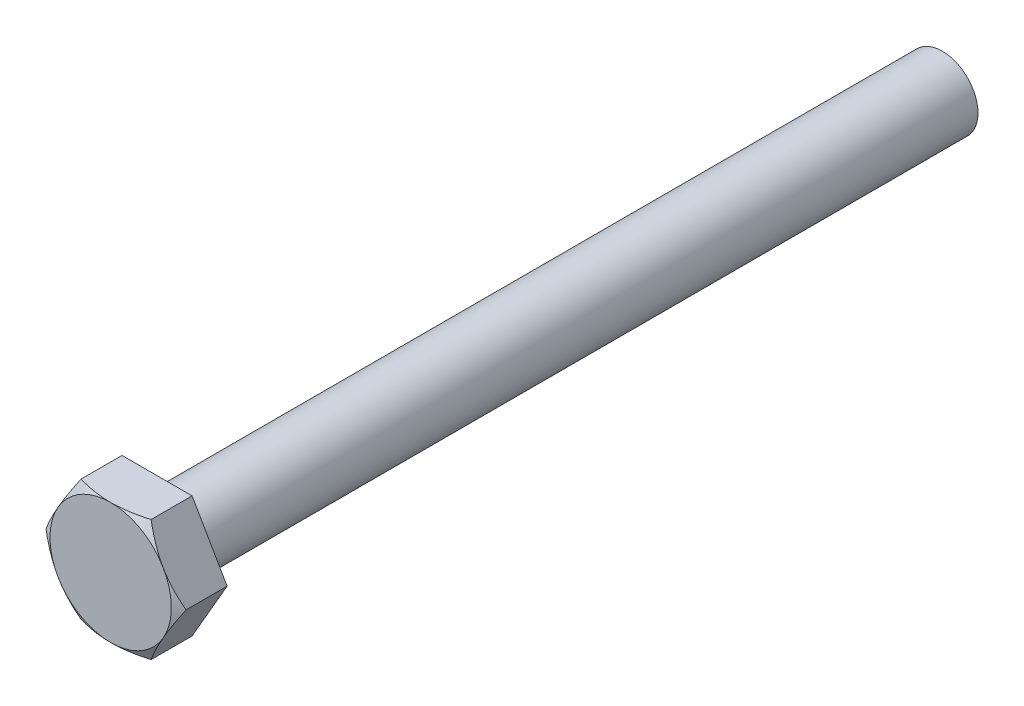
ISO-10303-21;
HEADER;
FILE_DESCRIPTION(('STEP AP214'),'2;1');
FILE_NAME('part.step','',(''),(''),'','','');
FILE_SCHEMA(('AUTOMOTIVE_DESIGN { 1 0 10303 214 1 1 1 1 }'));
ENDSEC;
DATA;
#1=APPLICATION_CONTEXT('core data for automotive mechanical design processes');
#2=APPLICATION_PROTOCOL_DEFINITION('international standard','automotive_design',2000,#1);
#3=PRODUCT_CONTEXT('',#1,'mechanical');
#4=PRODUCT('Part','Part','',(#3));
#5=PRODUCT_RELATED_PRODUCT_CATEGORY('part','',(#4));
#6=PRODUCT_DEFINITION_FORMATION('','',#4);
#7=PRODUCT_DEFINITION_CONTEXT('part definition',#1,'design');
#8=PRODUCT_DEFINITION('design','',#6,#7);
#9=PRODUCT_DEFINITION_SHAPE('','',#8);
#10=(LENGTH_UNIT() NAMED_UNIT(*) SI_UNIT(.MILLI.,.METRE.));
#11=(NAMED_UNIT(*) PLANE_ANGLE_UNIT() SI_UNIT($,.RADIAN.));
#12=(NAMED_UNIT(*) SI_UNIT($,.STERADIAN.) SOLID_ANGLE_UNIT());
#13=UNCERTAINTY_MEASURE_WITH_UNIT(LENGTH_MEASURE(1.E-05),#10,'distance_accuracy_value','');
#14=(GEOMETRIC_REPRESENTATION_CONTEXT(3) GLOBAL_UNCERTAINTY_ASSIGNED_CONTEXT((#13)) GLOBAL_UNIT_ASSIGNED_CONTEXT((#10,
#11,#12)) REPRESENTATION_CONTEXT('',''));
#15=CARTESIAN_POINT('',(0.,0.,0.));
#16=DIRECTION('',(0.,0.,1.));
#17=DIRECTION('',(1.,0.,0.));
#18=AXIS2_PLACEMENT_3D('',#15,#16,#17);
#19=CARTESIAN_POINT('',(-9.81495457622364,17.,123.));
#20=DIRECTION('',(0.866025403784438,-0.5,0.));
#21=DIRECTION('',(0.5,0.866025403784439,0.));
#22=AXIS2_PLACEMENT_3D('',#19,#20,#21);
#23=PLANE('',#22);
#24=CARTESIAN_POINT('',(-9.8148391061698,17.0002,121.481554575635));
#25=CARTESIAN_POINT('',(-10.0305678203106,16.6265469064567,121.606097159714));
#26=CARTESIAN_POINT('',(-10.2471379922619,16.251436365233,121.724988210087));
#27=CARTESIAN_POINT('',(-10.6820149725333,15.4982073403609,121.949896315283));
#28=CARTESIAN_POINT('',(-10.9003223270181,15.1200879107272,122.055909135882));
#29=CARTESIAN_POINT('',(-11.3390955943355,14.3601103187305,122.253635755638));
#30=CARTESIAN_POINT('',(-11.5595653468737,13.9782455058021,122.345315721686));
#31=CARTESIAN_POINT('',(-12.0020367960964,13.2118624748498,122.512407961256));
#32=CARTESIAN_POINT('',(-12.2240384042942,12.8273444100892,122.587821166432));
#33=CARTESIAN_POINT('',(-12.6638851266718,12.0655075393886,122.719172339868));
#34=CARTESIAN_POINT('',(-12.8816975866573,11.6882452921721,122.775545056779));
#35=CARTESIAN_POINT('',(-13.3183205574595,10.931992122991,122.870069499894));
#36=CARTESIAN_POINT('',(-13.5371310874053,10.5530011678939,122.908220875372));
#37=CARTESIAN_POINT('',(-13.9751197115118,9.79438261780433,122.965339335543));
#38=CARTESIAN_POINT('',(-14.1942970574164,9.41475631882946,122.984329216941));
#39=CARTESIAN_POINT('',(-14.6328540607501,8.65515330704033,123.002716299448));
#40=CARTESIAN_POINT('',(-14.8522337117183,8.27517660541658,123.002114105966));
#41=CARTESIAN_POINT('',(-15.2623694467912,7.56480067427072,122.982685296076));
#42=CARTESIAN_POINT('',(-15.4531547522161,7.23435083193735,122.96622784944));
#43=CARTESIAN_POINT('',(-15.8342702672496,6.57423939634648,122.918807466649));
#44=CARTESIAN_POINT('',(-16.0246004833366,6.2445777918682,122.887844738232));
#45=CARTESIAN_POINT('',(-16.4047337085118,5.58616773221974,122.811951054146));
#46=CARTESIAN_POINT('',(-16.5945360836128,5.25742037514752,122.76700746696));
#47=CARTESIAN_POINT('',(-16.9732372907546,4.60149064349036,122.663945146539));
#48=CARTESIAN_POINT('',(-17.1621361266206,4.27430826227985,122.605826469132));
#49=CARTESIAN_POINT('',(-17.7355629263239,3.281103910772,122.410229661277));
#50=CARTESIAN_POINT('',(-18.1184303000693,2.61795816688454,122.253247961959));
#51=CARTESIAN_POINT('',(-18.878456088099,1.30155488695447,121.89696389698));
#52=CARTESIAN_POINT('',(-19.2556242329599,0.648280497058983,121.697745203715));
#53=CARTESIAN_POINT('',(-19.6300246225011,-0.000199999999993854,121.481554575635));
#54=B_SPLINE_CURVE_WITH_KNOTS('',3,(#24,#25,#26,#27,#28,#29,#30,#31,#32,#33,#34,#35,#36,#37,#38,
#39,#40,#41,#42,#43,#44,#45,#46,#47,#48,#49,#50,#51,#52,#53),.UNSPECIFIED.,.F.,.F.,(4,2,2,2,2,2,
2,2,2,2,2,2,2,2,4),(0.,1.34725361023886,2.6949489909653,4.04577911356302,5.39653184888179,
6.71394507676439,8.03138366129191,9.3472530156348,10.6630817087628,11.808581597515,
12.9540650814946,14.1005865149997,15.2471030902392,17.590639246696,19.929575477219),.UNSPECIFIED.);
#55=CARTESIAN_POINT('',(-9.81495457622372,17.,121.48162124289));
#56=VERTEX_POINT('',#55);
#57=CARTESIAN_POINT('',(-14.7224318643355,8.5,123.));
#58=VERTEX_POINT('',#57);
#59=EDGE_CURVE('E124',#56,#58,#54,.T.);
#60=ORIENTED_EDGE('',*,*,#59,.F.);
#61=DIRECTION('',(0.,0.,-1.));
#62=VECTOR('',#61,1.);
#63=CARTESIAN_POINT('',(-9.81495457622364,17.,123.));
#64=LINE('',#63,#62);
#65=CARTESIAN_POINT('',(-9.81495457622364,17.,110.));
#66=VERTEX_POINT('',#65);
#67=EDGE_CURVE('E290',#56,#66,#64,.T.);
#68=ORIENTED_EDGE('',*,*,#67,.T.);
#69=DIRECTION('',(-0.5,-0.866025403784438,0.));
#70=VECTOR('',#69,1.);
#71=CARTESIAN_POINT('',(-9.81495457622364,17.,110.));
#72=LINE('',#71,#70);
#73=CARTESIAN_POINT('',(-19.6299091524473,0.,110.));
#74=VERTEX_POINT('',#73);
#75=EDGE_CURVE('E132',#66,#74,#72,.T.);
#76=ORIENTED_EDGE('',*,*,#75,.T.);
#77=DIRECTION('',(0.,0.,-1.));
#78=VECTOR('',#77,1.);
#79=CARTESIAN_POINT('',(-19.6299091524473,0.,123.));
#80=LINE('',#79,#78);
#81=CARTESIAN_POINT('',(-19.6299091524473,0.,121.48162124289));
#82=VERTEX_POINT('',#81);
#83=EDGE_CURVE('E147',#82,#74,#80,.T.);
#84=ORIENTED_EDGE('',*,*,#83,.F.);
#85=EDGE_CURVE('E133',#58,#82,#54,.T.);
#86=ORIENTED_EDGE('',*,*,#85,.F.);
#87=EDGE_LOOP('',(#60,#68,#76,#84,#86));
#88=FACE_BOUND('',#87,.T.);
#89=ADVANCED_FACE('F54',(#88),#23,.F.);
#90=CARTESIAN_POINT('',(-19.6299091524473,0.,123.));
#91=DIRECTION('',(0.866025403784439,0.5,0.));
#92=DIRECTION('',(-0.5,0.866025403784439,0.));
#93=AXIS2_PLACEMENT_3D('',#90,#91,#92);
#94=PLANE('',#93);
#95=CARTESIAN_POINT('',(-19.6300246225011,0.000200000000006953,121.481554575635));
#96=CARTESIAN_POINT('',(-19.4142959083604,-0.373453093543279,121.606097159714));
#97=CARTESIAN_POINT('',(-19.197725736409,-0.748563634767002,121.724988210087));
#98=CARTESIAN_POINT('',(-18.7628487561377,-1.50179265963908,121.949896315283));
#99=CARTESIAN_POINT('',(-18.5445414016528,-1.87991208927282,122.055909135882));
#100=CARTESIAN_POINT('',(-18.1057681343354,-2.6398896812695,122.253635755638));
#101=CARTESIAN_POINT('',(-17.8852983817972,-3.02175449419785,122.345315721686));
#102=CARTESIAN_POINT('',(-17.4428269325745,-3.78813752515018,122.512407961256));
#103=CARTESIAN_POINT('',(-17.2208253243767,-4.17265558991079,122.587821166432));
#104=CARTESIAN_POINT('',(-16.7809786019991,-4.93449246061139,122.719172339868));
#105=CARTESIAN_POINT('',(-16.5631661420136,-5.31175470782786,122.775545056779));
#106=CARTESIAN_POINT('',(-16.1265431712114,-6.06800787700895,122.870069499894));
#107=CARTESIAN_POINT('',(-15.9077326412656,-6.44699883210611,122.908220875372));
#108=CARTESIAN_POINT('',(-15.4697440171592,-7.20561738219567,122.965339335543));
#109=CARTESIAN_POINT('',(-15.2505666712546,-7.58524368117054,122.984329216941));
#110=CARTESIAN_POINT('',(-14.8120096679209,-8.34484669295966,123.002716299448));
#111=CARTESIAN_POINT('',(-14.5926300169526,-8.72482339458342,123.002114105966));
#112=CARTESIAN_POINT('',(-14.1824942818797,-9.43519932572928,122.982685296076));
#113=CARTESIAN_POINT('',(-13.9917089764549,-9.76564916806265,122.96622784944));
#114=CARTESIAN_POINT('',(-13.6105934614213,-10.4257606036535,122.918807466649));
#115=CARTESIAN_POINT('',(-13.4202632453343,-10.7554222081318,122.887844738232));
#116=CARTESIAN_POINT('',(-13.0401300201591,-11.4138322677803,122.811951054146));
#117=CARTESIAN_POINT('',(-12.8503276450581,-11.7425796248525,122.76700746696));
#118=CARTESIAN_POINT('',(-12.4716264379163,-12.3985093565097,122.663945146539));
#119=CARTESIAN_POINT('',(-12.2827276020504,-12.7256917377202,122.605826469132));
#120=CARTESIAN_POINT('',(-11.709300802347,-13.718896089228,122.410229661277));
#121=CARTESIAN_POINT('',(-11.3264334286016,-14.3820418331155,122.253247961959));
#122=CARTESIAN_POINT('',(-10.5664076405719,-15.6984451130455,121.89696389698));
#123=CARTESIAN_POINT('',(-10.189239495711,-16.351719502941,121.697745203715));
#124=CARTESIAN_POINT('',(-9.81483910616981,-17.0002,121.481554575635));
#125=B_SPLINE_CURVE_WITH_KNOTS('',3,(#95,#96,#97,#98,#99,#100,#101,#102,#103,#104,#105,#106,
#107,#108,#109,#110,#111,#112,#113,#114,#115,#116,#117,#118,#119,#120,#121,#122,#123,#124),
.UNSPECIFIED.,.F.,.F.,(4,2,2,2,2,2,2,2,2,2,2,2,2,2,4),(0.,1.34725361023886,2.6949489909653,
4.04577911356303,5.39653184888179,6.71394507676439,8.03138366129191,9.3472530156348,
10.6630817087628,11.808581597515,12.9540650814946,14.1005865149997,15.2471030902392,
17.590639246696,19.929575477219),.UNSPECIFIED.);
#126=CARTESIAN_POINT('',(-14.7224318643355,-8.49999999999999,123.));
#127=VERTEX_POINT('',#126);
#128=EDGE_CURVE('E139',#82,#127,#125,.T.);
#129=ORIENTED_EDGE('',*,*,#128,.F.);
#130=ORIENTED_EDGE('',*,*,#83,.T.);
#131=DIRECTION('',(0.5,-0.866025403784439,0.));
#132=VECTOR('',#131,1.);
#133=CARTESIAN_POINT('',(-19.6299091524473,0.,110.));
#134=LINE('',#133,#132);
#135=CARTESIAN_POINT('',(-9.81495457622365,-17.,110.));
#136=VERTEX_POINT('',#135);
#137=EDGE_CURVE('E281',#74,#136,#134,.T.);
#138=ORIENTED_EDGE('',*,*,#137,.T.);
#139=DIRECTION('',(0.,0.,-1.));
#140=VECTOR('',#139,1.);
#141=CARTESIAN_POINT('',(-9.81495457622365,-17.,123.));
#142=LINE('',#141,#140);
#143=CARTESIAN_POINT('',(-9.81495457622364,-17.,121.48162124289));
#144=VERTEX_POINT('',#143);
#145=EDGE_CURVE('E220',#144,#136,#142,.T.);
#146=ORIENTED_EDGE('',*,*,#145,.F.);
#147=EDGE_CURVE('E148',#127,#144,#125,.T.);
#148=ORIENTED_EDGE('',*,*,#147,.F.);
#149=EDGE_LOOP('',(#129,#130,#138,#146,#148));
#150=FACE_BOUND('',#149,.T.);
#151=ADVANCED_FACE('F208',(#150),#94,.F.);
#152=CARTESIAN_POINT('',(-9.81495457622365,-17.,123.));
#153=DIRECTION('',(0.,1.,0.));
#154=DIRECTION('',(-1.,0.,0.));
#155=AXIS2_PLACEMENT_3D('',#152,#153,#154);
#156=PLANE('',#155);
#157=CARTESIAN_POINT('',(-33.3594390914374,-17.,111.198200452818));
#158=CARTESIAN_POINT('',(-32.9706384399209,-17.,111.398200341522));
#159=CARTESIAN_POINT('',(-32.5815463697824,-17.,111.597633532846));
#160=CARTESIAN_POINT('',(-31.8027233805918,-17.,111.995251496857));
#161=CARTESIAN_POINT('',(-31.4129924595114,-17.,112.193436265571));
#162=CARTESIAN_POINT('',(-30.2427485766612,-17.,112.785949845329));
#163=CARTESIAN_POINT('',(-29.4611969892124,-17.,113.178231493841));
#164=CARTESIAN_POINT('',(-27.8935184038367,-17.,113.956814896487));
#165=CARTESIAN_POINT('',(-27.1073860038298,-17.,114.343105786825));
#166=CARTESIAN_POINT('',(-25.5311529294212,-17.,115.107546965402));
#167=CARTESIAN_POINT('',(-24.7410521985541,-17.,115.485697137402));
#168=CARTESIAN_POINT('',(-23.1145376879579,-17.,116.2514552716));
#169=CARTESIAN_POINT('',(-22.2778673101212,-17.,116.638519868649));
#170=CARTESIAN_POINT('',(-20.5981167469354,-17.,117.398404783723));
#171=CARTESIAN_POINT('',(-19.7550368875432,-17.,117.771225820376));
#172=CARTESIAN_POINT('',(-18.061526541666,-17.,118.498321900441));
#173=CARTESIAN_POINT('',(-17.2111013562626,-17.,118.852609197419));
#174=CARTESIAN_POINT('',(-15.928168866174,-17.,119.366137912946));
#175=CARTESIAN_POINT('',(-15.4992497889601,-17.,119.534352215754));
#176=CARTESIAN_POINT('',(-14.6387752894349,-17.,119.863893146348));
#177=CARTESIAN_POINT('',(-14.2072199070388,-17.,120.025219878121));
#178=CARTESIAN_POINT('',(-13.2705534680974,-17.,120.365665215771));
#179=CARTESIAN_POINT('',(-12.764933658292,-17.,120.543389924138));
#180=CARTESIAN_POINT('',(-11.7494203696704,-17.,120.886288145336));
#181=CARTESIAN_POINT('',(-11.239526749489,-17.,121.051461241163));
#182=CARTESIAN_POINT('',(-10.2153963896819,-17.,121.367001548691));
#183=CARTESIAN_POINT('',(-9.7011616171184,-17.,121.517375112454));
#184=CARTESIAN_POINT('',(-8.66797714981288,-17.,121.80091330825));
#185=CARTESIAN_POINT('',(-8.1490277774271,-17.,121.934079107511));
#186=CARTESIAN_POINT('',(-7.11627869390759,-17.,122.178166776831));
#187=CARTESIAN_POINT('',(-6.60256797273478,-17.,122.28946260962));
#188=CARTESIAN_POINT('',(-5.57087885460679,-17.,122.490244244432));
#189=CARTESIAN_POINT('',(-5.05290056211455,-17.,122.579730578684));
#190=CARTESIAN_POINT('',(-4.01353673617296,-17.,122.734336765993));
#191=CARTESIAN_POINT('',(-3.49215293797092,-17.,122.799468172559));
#192=CARTESIAN_POINT('',(-2.44673843214667,-17.,122.903320175113));
#193=CARTESIAN_POINT('',(-1.92270774566775,-17.,122.942040981733));
#194=CARTESIAN_POINT('',(-0.866331051381183,-17.,122.992025199195));
#195=CARTESIAN_POINT('',(-0.333967188718458,-17.,123.002916359029));
#196=CARTESIAN_POINT('',(0.730562845189475,-17.,122.995748240286));
#197=CARTESIAN_POINT('',(1.26272901631554,-17.,122.97768894429));
#198=CARTESIAN_POINT('',(2.32548141066001,-17.,122.913297121544));
#199=CARTESIAN_POINT('',(2.8560671380901,-17.,122.866956504217));
#200=CARTESIAN_POINT('',(3.91421698536023,-17.,122.747652274884));
#201=CARTESIAN_POINT('',(4.44178103064212,-17.,122.674688008807));
#202=CARTESIAN_POINT('',(5.50347774255836,-17.,122.502771693266));
#203=CARTESIAN_POINT('',(6.03753008880447,-17.,122.403328016736));
#204=CARTESIAN_POINT('',(7.1009799089611,-17.,122.18202170468));
#205=CARTESIAN_POINT('',(7.63037694417917,-17.,122.060156979539));
#206=CARTESIAN_POINT('',(8.68434813605264,-17.,121.796907815006));
#207=CARTESIAN_POINT('',(9.20892152613574,-17.,121.655520328352));
#208=CARTESIAN_POINT('',(10.2532381184158,-17.,121.355991754241));
#209=CARTESIAN_POINT('',(10.772981293492,-17.,121.197850572779));
#210=CARTESIAN_POINT('',(11.7842418712065,-17.,120.874837972002));
#211=CARTESIAN_POINT('',(12.2759639920886,-17.,120.710604094316));
#212=CARTESIAN_POINT('',(13.2555552358258,-17.,120.370995719983));
#213=CARTESIAN_POINT('',(13.7434242011549,-17.,120.195620770486));
#214=CARTESIAN_POINT('',(14.7157163146482,-17.,119.835312629295));
#215=CARTESIAN_POINT('',(15.2001387778271,-17.,119.650377594769));
#216=CARTESIAN_POINT('',(16.1657754363849,-17.,119.27235041045));
#217=CARTESIAN_POINT('',(16.6469896725089,-17.,119.079258364482));
#218=CARTESIAN_POINT('',(17.6070543041451,-17.,118.685861007233));
#219=CARTESIAN_POINT('',(18.0859016332031,-17.,118.485548226496));
#220=CARTESIAN_POINT('',(19.0410219112312,-17.,118.078869062008));
#221=CARTESIAN_POINT('',(19.5172948200784,-17.,117.872502584229));
#222=CARTESIAN_POINT('',(20.9425589284718,-17.,117.245638547753));
#223=CARTESIAN_POINT('',(21.8881155100321,-17.,116.817326718112));
#224=CARTESIAN_POINT('',(23.7189693100116,-17.,115.969495454374));
#225=CARTESIAN_POINT('',(24.6046666073102,-17.,115.550834696491));
#226=CARTESIAN_POINT('',(26.3708127505341,-17.,114.702530929011));
#227=CARTESIAN_POINT('',(27.2512614275654,-17.,114.272887568335));
#228=CARTESIAN_POINT('',(29.0050255734999,-17.,113.406308704853));
#229=CARTESIAN_POINT('',(29.878354886783,-17.,112.969401167034));
#230=CARTESIAN_POINT('',(31.1856724276973,-17.,112.308842728705));
#231=CARTESIAN_POINT('',(31.6209813254044,-17.,112.087799435296));
#232=CARTESIAN_POINT('',(32.490794121875,-17.,111.644139396376));
#233=CARTESIAN_POINT('',(32.9252980243898,-17.,111.421522658221));
#234=CARTESIAN_POINT('',(33.3594390914374,-17.,111.198200452818));
#235=B_SPLINE_CURVE_WITH_KNOTS('',3,(#157,#158,#159,#160,#161,#162,#163,#164,#165,#166,#167,
#168,#169,#170,#171,#172,#173,#174,#175,#176,#177,#178,#179,#180,#181,#182,#183,#184,#185,#186,
#187,#188,#189,#190,#191,#192,#193,#194,#195,#196,#197,#198,#199,#200,#201,#202,#203,#204,#205,
#206,#207,#208,#209,#210,#211,#212,#213,#214,#215,#216,#217,#218,#219,#220,#221,#222,#223,#224,
#225,#226,#227,#228,#229,#230,#231,#232,#233,#234),.UNSPECIFIED.,.F.,.F.,(4,2,2,2,2,2,2,2,2,2,2,
2,2,2,2,2,2,2,2,2,2,2,2,2,2,2,2,2,2,2,2,2,2,2,2,2,2,2,4),(0.,1.31167483529986,2.62335384351833,
5.24675402190231,7.87445718666224,10.502197847419,13.267688167751,16.0330387763388,
18.7965373491278,20.1786645378782,21.5607708520237,23.1684653159108,24.7762131691943,
26.38326792872,27.9902136222274,29.5666833551458,31.1431146127258,32.7187970901174,
34.2944670008276,35.8911053967669,37.487744753412,39.0848410828587,40.6819766513632,
42.3111281278075,43.9404315163644,45.5699895073477,47.1995566424574,48.7546761403721,
50.3098588894954,51.8653425462884,53.4208064104485,54.9779282932983,56.5350743745854,
59.6489770134654,62.5878774038527,65.5268718593572,68.4563941123712,69.9210368195007,
71.3856726840938),.UNSPECIFIED.);
#236=CARTESIAN_POINT('',(0.,-17.,123.));
#237=VERTEX_POINT('',#236);
#238=EDGE_CURVE('E202',#144,#237,#235,.T.);
#239=ORIENTED_EDGE('',*,*,#238,.F.);
#240=ORIENTED_EDGE('',*,*,#145,.T.);
#241=DIRECTION('',(1.,0.,0.));
#242=VECTOR('',#241,1.);
#243=CARTESIAN_POINT('',(-9.81495457622365,-17.,110.));
#244=LINE('',#243,#242);
#245=CARTESIAN_POINT('',(9.81495457622364,-17.,110.));
#246=VERTEX_POINT('',#245);
#247=EDGE_CURVE('E237',#136,#246,#244,.T.);
#248=ORIENTED_EDGE('',*,*,#247,.T.);
#249=DIRECTION('',(0.,0.,-1.));
#250=VECTOR('',#249,1.);
#251=CARTESIAN_POINT('',(9.81495457622364,-17.,123.));
#252=LINE('',#251,#250);
#253=CARTESIAN_POINT('',(9.81495457622364,-17.,121.48162124289));
#254=VERTEX_POINT('',#253);
#255=EDGE_CURVE('E235',#254,#246,#252,.T.);
#256=ORIENTED_EDGE('',*,*,#255,.F.);
#257=EDGE_CURVE('E196',#237,#254,#235,.T.);
#258=ORIENTED_EDGE('',*,*,#257,.F.);
#259=EDGE_LOOP('',(#239,#240,#248,#256,#258));
#260=FACE_BOUND('',#259,.T.);
#261=ADVANCED_FACE('F204',(#260),#156,.F.);
#262=CARTESIAN_POINT('',(9.81495457622364,-17.,123.));
#263=DIRECTION('',(-0.866025403784438,0.5,0.));
#264=DIRECTION('',(-0.5,-0.866025403784439,0.));
#265=AXIS2_PLACEMENT_3D('',#262,#263,#264);
#266=PLANE('',#265);
#267=CARTESIAN_POINT('',(9.8148391061698,-17.0002,121.481554575635));
#268=CARTESIAN_POINT('',(10.0305678203106,-16.6265469064567,121.606097159714));
#269=CARTESIAN_POINT('',(10.2471379922619,-16.251436365233,121.724988210087));
#270=CARTESIAN_POINT('',(10.6820149725333,-15.4982073403609,121.949896315283));
#271=CARTESIAN_POINT('',(10.9003223270181,-15.1200879107272,122.055909135882));
#272=CARTESIAN_POINT('',(11.3390955943355,-14.3601103187305,122.253635755638));
#273=CARTESIAN_POINT('',(11.5595653468737,-13.9782455058021,122.345315721686));
#274=CARTESIAN_POINT('',(12.0020367960964,-13.2118624748498,122.512407961256));
#275=CARTESIAN_POINT('',(12.2240384042942,-12.8273444100892,122.587821166432));
#276=CARTESIAN_POINT('',(12.6638851266718,-12.0655075393886,122.719172339868));
#277=CARTESIAN_POINT('',(12.8816975866573,-11.6882452921721,122.77554505678));
#278=CARTESIAN_POINT('',(13.3183205574595,-10.931992122991,122.870069499894));
#279=CARTESIAN_POINT('',(13.5371310874053,-10.5530011678939,122.908220875372));
#280=CARTESIAN_POINT('',(13.9751197115118,-9.79438261780432,122.965339335543));
#281=CARTESIAN_POINT('',(14.1942970574164,-9.41475631882945,122.984329216941));
#282=CARTESIAN_POINT('',(14.6328540607501,-8.65515330704033,123.002716299448));
#283=CARTESIAN_POINT('',(14.8522337117183,-8.27517660541657,123.002114105966));
#284=CARTESIAN_POINT('',(15.2623694467912,-7.56480067427071,122.982685296076));
#285=CARTESIAN_POINT('',(15.4531547522161,-7.23435083193734,122.96622784944));
#286=CARTESIAN_POINT('',(15.8342702672496,-6.57423939634648,122.918807466649));
#287=CARTESIAN_POINT('',(16.0246004833366,-6.24457779186819,122.887844738232));
#288=CARTESIAN_POINT('',(16.4047337085118,-5.58616773221973,122.811951054146));
#289=CARTESIAN_POINT('',(16.5945360836128,-5.25742037514751,122.76700746696));
#290=CARTESIAN_POINT('',(16.9732372907546,-4.60149064349034,122.663945146539));
#291=CARTESIAN_POINT('',(17.1621361266206,-4.27430826227984,122.605826469132));
#292=CARTESIAN_POINT('',(17.7355629263239,-3.28110391077199,122.410229661277));
#293=CARTESIAN_POINT('',(18.1184303000693,-2.61795816688453,122.253247961959));
#294=CARTESIAN_POINT('',(18.878456088099,-1.30155488695445,121.89696389698));
#295=CARTESIAN_POINT('',(19.2556242329599,-0.648280497058969,121.697745203715));
#296=CARTESIAN_POINT('',(19.6300246225011,0.000200000000006671,121.481554575635));
#297=B_SPLINE_CURVE_WITH_KNOTS('',3,(#267,#268,#269,#270,#271,#272,#273,#274,#275,#276,#277,
#278,#279,#280,#281,#282,#283,#284,#285,#286,#287,#288,#289,#290,#291,#292,#293,#294,#295,#296),
.UNSPECIFIED.,.F.,.F.,(4,2,2,2,2,2,2,2,2,2,2,2,2,2,4),(0.,1.34725361023887,2.6949489909653,
4.04577911356303,5.3965318488818,6.7139450767644,8.03138366129191,9.3472530156348,
10.6630817087628,11.808581597515,12.9540650814946,14.1005865149997,15.2471030902392,
17.590639246696,19.929575477219),.UNSPECIFIED.);
#298=CARTESIAN_POINT('',(14.7224318643355,-8.5,123.));
#299=VERTEX_POINT('',#298);
#300=EDGE_CURVE('E203',#254,#299,#297,.T.);
#301=ORIENTED_EDGE('',*,*,#300,.F.);
#302=ORIENTED_EDGE('',*,*,#255,.T.);
#303=DIRECTION('',(0.5,0.866025403784439,0.));
#304=VECTOR('',#303,1.);
#305=CARTESIAN_POINT('',(9.81495457622364,-17.,110.));
#306=LINE('',#305,#304);
#307=CARTESIAN_POINT('',(19.6299091524473,0.,110.));
#308=VERTEX_POINT('',#307);
#309=EDGE_CURVE('E282',#246,#308,#306,.T.);
#310=ORIENTED_EDGE('',*,*,#309,.T.);
#311=DIRECTION('',(0.,0.,-1.));
#312=VECTOR('',#311,1.);
#313=CARTESIAN_POINT('',(19.6299091524473,0.,123.));
#314=LINE('',#313,#312);
#315=CARTESIAN_POINT('',(19.6299091524473,0.,121.48162124289));
#316=VERTEX_POINT('',#315);
#317=EDGE_CURVE('E241',#316,#308,#314,.T.);
#318=ORIENTED_EDGE('',*,*,#317,.F.);
#319=EDGE_CURVE('E190',#299,#316,#297,.T.);
#320=ORIENTED_EDGE('',*,*,#319,.F.);
#321=EDGE_LOOP('',(#301,#302,#310,#318,#320));
#322=FACE_BOUND('',#321,.T.);
#323=ADVANCED_FACE('F207',(#322),#266,.F.);
#324=CARTESIAN_POINT('',(19.6299091524473,0.,123.));
#325=DIRECTION('',(-0.866025403784439,-0.5,0.));
#326=DIRECTION('',(0.5,-0.866025403784439,0.));
#327=AXIS2_PLACEMENT_3D('',#324,#325,#326);
#328=PLANE('',#327);
#329=CARTESIAN_POINT('',(19.6300246225011,-0.000199999999993507,121.481554575635));
#330=CARTESIAN_POINT('',(19.4142959083604,0.373453093543293,121.606097159714));
#331=CARTESIAN_POINT('',(19.197725736409,0.748563634767016,121.724988210087));
#332=CARTESIAN_POINT('',(18.7628487561376,1.50179265963909,121.949896315283));
#333=CARTESIAN_POINT('',(18.5445414016528,1.87991208927283,122.055909135882));
#334=CARTESIAN_POINT('',(18.1057681343354,2.63988968126952,122.253635755638));
#335=CARTESIAN_POINT('',(17.8852983817972,3.02175449419786,122.345315721686));
#336=CARTESIAN_POINT('',(17.4428269325745,3.78813752515019,122.512407961256));
#337=CARTESIAN_POINT('',(17.2208253243767,4.17265558991081,122.587821166432));
#338=CARTESIAN_POINT('',(16.7809786019991,4.9344924606114,122.719172339868));
#339=CARTESIAN_POINT('',(16.5631661420136,5.31175470782788,122.775545056779));
#340=CARTESIAN_POINT('',(16.1265431712114,6.06800787700896,122.870069499894));
#341=CARTESIAN_POINT('',(15.9077326412656,6.44699883210613,122.908220875372));
#342=CARTESIAN_POINT('',(15.4697440171592,7.20561738219568,122.965339335543));
#343=CARTESIAN_POINT('',(15.2505666712546,7.58524368117055,122.984329216941));
#344=CARTESIAN_POINT('',(14.8120096679209,8.34484669295967,123.002716299448));
#345=CARTESIAN_POINT('',(14.5926300169526,8.72482339458343,123.002114105966));
#346=CARTESIAN_POINT('',(14.1824942818797,9.43519932572929,122.982685296076));
#347=CARTESIAN_POINT('',(13.9917089764549,9.76564916806266,122.96622784944));
#348=CARTESIAN_POINT('',(13.6105934614213,10.4257606036535,122.918807466649));
#349=CARTESIAN_POINT('',(13.4202632453343,10.7554222081318,122.887844738232));
#350=CARTESIAN_POINT('',(13.0401300201591,11.4138322677803,122.811951054146));
#351=CARTESIAN_POINT('',(12.8503276450581,11.7425796248525,122.76700746696));
#352=CARTESIAN_POINT('',(12.4716264379163,12.3985093565097,122.663945146539));
#353=CARTESIAN_POINT('',(12.2827276020504,12.7256917377202,122.605826469132));
#354=CARTESIAN_POINT('',(11.709300802347,13.718896089228,122.410229661277));
#355=CARTESIAN_POINT('',(11.3264334286016,14.3820418331155,122.253247961959));
#356=CARTESIAN_POINT('',(10.5664076405719,15.6984451130455,121.89696389698));
#357=CARTESIAN_POINT('',(10.189239495711,16.351719502941,121.697745203715));
#358=CARTESIAN_POINT('',(9.81483910616982,17.0002,121.481554575635));
#359=B_SPLINE_CURVE_WITH_KNOTS('',3,(#329,#330,#331,#332,#333,#334,#335,#336,#337,#338,#339,
#340,#341,#342,#343,#344,#345,#346,#347,#348,#349,#350,#351,#352,#353,#354,#355,#356,#357,#358),
.UNSPECIFIED.,.F.,.F.,(4,2,2,2,2,2,2,2,2,2,2,2,2,2,4),(0.,1.34725361023886,2.6949489909653,
4.04577911356303,5.3965318488818,6.71394507676439,8.03138366129191,9.3472530156348,
10.6630817087628,11.808581597515,12.9540650814946,14.1005865149997,15.2471030902392,
17.590639246696,19.929575477219),.UNSPECIFIED.);
#360=CARTESIAN_POINT('',(14.7224318643355,8.5,123.));
#361=VERTEX_POINT('',#360);
#362=EDGE_CURVE('E299',#316,#361,#359,.T.);
#363=ORIENTED_EDGE('',*,*,#362,.F.);
#364=ORIENTED_EDGE('',*,*,#317,.T.);
#365=DIRECTION('',(-0.5,0.866025403784439,0.));
#366=VECTOR('',#365,1.);
#367=CARTESIAN_POINT('',(19.6299091524473,0.,110.));
#368=LINE('',#367,#366);
#369=CARTESIAN_POINT('',(9.81495457622365,17.,110.));
#370=VERTEX_POINT('',#369);
#371=EDGE_CURVE('E286',#308,#370,#368,.T.);
#372=ORIENTED_EDGE('',*,*,#371,.T.);
#373=DIRECTION('',(0.,0.,-1.));
#374=VECTOR('',#373,1.);
#375=CARTESIAN_POINT('',(9.81495457622365,17.,123.));
#376=LINE('',#375,#374);
#377=CARTESIAN_POINT('',(9.81495457622365,17.,121.48162124289));
#378=VERTEX_POINT('',#377);
#379=EDGE_CURVE('E244',#378,#370,#376,.T.);
#380=ORIENTED_EDGE('',*,*,#379,.F.);
#381=EDGE_CURVE('E182',#361,#378,#359,.T.);
#382=ORIENTED_EDGE('',*,*,#381,.F.);
#383=EDGE_LOOP('',(#363,#364,#372,#380,#382));
#384=FACE_BOUND('',#383,.T.);
#385=ADVANCED_FACE('F272',(#384),#328,.F.);
#386=CARTESIAN_POINT('',(9.81495457622365,17.,123.));
#387=DIRECTION('',(0.,-1.,0.));
#388=DIRECTION('',(0.,0.,-1.));
#389=AXIS2_PLACEMENT_3D('',#386,#387,#388);
#390=PLANE('',#389);
#391=CARTESIAN_POINT('',(33.3594390914374,17.,111.198200452818));
#392=CARTESIAN_POINT('',(32.9706384399209,17.,111.398200341522));
#393=CARTESIAN_POINT('',(32.5815463697824,17.,111.597633532846));
#394=CARTESIAN_POINT('',(31.8027233805918,17.,111.995251496857));
#395=CARTESIAN_POINT('',(31.4129924595114,17.,112.19343626557));
#396=CARTESIAN_POINT('',(30.2427485766612,17.,112.785949845329));
#397=CARTESIAN_POINT('',(29.4611969892124,17.,113.178231493841));
#398=CARTESIAN_POINT('',(27.8935184038367,17.,113.956814896487));
#399=CARTESIAN_POINT('',(27.1073860038298,17.,114.343105786825));
#400=CARTESIAN_POINT('',(25.5311529294212,17.,115.107546965402));
#401=CARTESIAN_POINT('',(24.7410521985541,17.,115.485697137402));
#402=CARTESIAN_POINT('',(23.1145376879579,17.,116.2514552716));
#403=CARTESIAN_POINT('',(22.2778673101212,17.,116.638519868649));
#404=CARTESIAN_POINT('',(20.5981167469354,17.,117.398404783723));
#405=CARTESIAN_POINT('',(19.7550368875432,17.,117.771225820376));
#406=CARTESIAN_POINT('',(18.061526541666,17.,118.498321900441));
#407=CARTESIAN_POINT('',(17.2111013562626,17.,118.852609197419));
#408=CARTESIAN_POINT('',(15.928168866174,17.,119.366137912946));
#409=CARTESIAN_POINT('',(15.4992497889601,17.,119.534352215754));
#410=CARTESIAN_POINT('',(14.6387752894349,17.,119.863893146348));
#411=CARTESIAN_POINT('',(14.2072199070388,17.,120.025219878121));
#412=CARTESIAN_POINT('',(13.2705534680974,17.,120.365665215771));
#413=CARTESIAN_POINT('',(12.764933658292,17.,120.543389924138));
#414=CARTESIAN_POINT('',(11.7494203696704,17.,120.886288145336));
#415=CARTESIAN_POINT('',(11.239526749489,17.,121.051461241163));
#416=CARTESIAN_POINT('',(10.2153963896819,17.,121.367001548691));
#417=CARTESIAN_POINT('',(9.7011616171184,17.,121.517375112454));
#418=CARTESIAN_POINT('',(8.66797714981288,17.,121.80091330825));
#419=CARTESIAN_POINT('',(8.14902777742711,17.,121.934079107511));
#420=CARTESIAN_POINT('',(7.11627869390759,17.,122.178166776831));
#421=CARTESIAN_POINT('',(6.60256797273479,17.,122.28946260962));
#422=CARTESIAN_POINT('',(5.5708788546068,17.,122.490244244432));
#423=CARTESIAN_POINT('',(5.05290056211456,17.,122.579730578684));
#424=CARTESIAN_POINT('',(4.01353673617297,17.,122.734336765993));
#425=CARTESIAN_POINT('',(3.49215293797093,17.,122.799468172559));
#426=CARTESIAN_POINT('',(2.44673843214668,17.,122.903320175113));
#427=CARTESIAN_POINT('',(1.92270774566776,17.,122.942040981733));
#428=CARTESIAN_POINT('',(0.866331051381189,17.,122.992025199195));
#429=CARTESIAN_POINT('',(0.333967188718463,17.,123.002916359029));
#430=CARTESIAN_POINT('',(-0.730562845189469,17.,122.995748240286));
#431=CARTESIAN_POINT('',(-1.26272901631553,17.,122.97768894429));
#432=CARTESIAN_POINT('',(-2.32548141066,17.,122.913297121544));
#433=CARTESIAN_POINT('',(-2.85606713809009,17.,122.866956504217));
#434=CARTESIAN_POINT('',(-3.91421698536023,17.,122.747652274884));
#435=CARTESIAN_POINT('',(-4.44178103064211,17.,122.674688008807));
#436=CARTESIAN_POINT('',(-5.50347774255836,17.,122.502771693266));
#437=CARTESIAN_POINT('',(-6.03753008880447,17.,122.403328016736));
#438=CARTESIAN_POINT('',(-7.1009799089611,17.,122.18202170468));
#439=CARTESIAN_POINT('',(-7.63037694417917,17.,122.060156979539));
#440=CARTESIAN_POINT('',(-8.68434813605263,17.,121.796907815006));
#441=CARTESIAN_POINT('',(-9.20892152613573,17.,121.655520328352));
#442=CARTESIAN_POINT('',(-10.2532381184157,17.,121.355991754241));
#443=CARTESIAN_POINT('',(-10.7729812934919,17.,121.197850572779));
#444=CARTESIAN_POINT('',(-11.7842418712065,17.,120.874837972002));
#445=CARTESIAN_POINT('',(-12.2759639920886,17.,120.710604094316));
#446=CARTESIAN_POINT('',(-13.2555552358258,17.,120.370995719983));
#447=CARTESIAN_POINT('',(-13.7434242011549,17.,120.195620770486));
#448=CARTESIAN_POINT('',(-14.7157163146482,17.,119.835312629295));
#449=CARTESIAN_POINT('',(-15.2001387778271,17.,119.650377594769));
#450=CARTESIAN_POINT('',(-16.1657754363849,17.,119.27235041045));
#451=CARTESIAN_POINT('',(-16.6469896725089,17.,119.079258364482));
#452=CARTESIAN_POINT('',(-17.6070543041451,17.,118.685861007233));
#453=CARTESIAN_POINT('',(-18.0859016332031,17.,118.485548226496));
#454=CARTESIAN_POINT('',(-19.0410219112312,17.,118.078869062008));
#455=CARTESIAN_POINT('',(-19.5172948200785,17.,117.872502584229));
#456=CARTESIAN_POINT('',(-20.9425589284718,17.,117.245638547753));
#457=CARTESIAN_POINT('',(-21.8881155100321,17.,116.817326718112));
#458=CARTESIAN_POINT('',(-23.7189693100116,17.,115.969495454374));
#459=CARTESIAN_POINT('',(-24.6046666073102,17.,115.550834696491));
#460=CARTESIAN_POINT('',(-26.3708127505341,17.,114.702530929011));
#461=CARTESIAN_POINT('',(-27.2512614275654,17.,114.272887568335));
#462=CARTESIAN_POINT('',(-29.0050255734999,17.,113.406308704853));
#463=CARTESIAN_POINT('',(-29.878354886783,17.,112.969401167034));
#464=CARTESIAN_POINT('',(-31.1856724276974,17.,112.308842728705));
#465=CARTESIAN_POINT('',(-31.6209813254044,17.,112.087799435296));
#466=CARTESIAN_POINT('',(-32.490794121875,17.,111.644139396376));
#467=CARTESIAN_POINT('',(-32.9252980243898,17.,111.421522658221));
#468=CARTESIAN_POINT('',(-33.3594390914374,17.,111.198200452818));
#469=B_SPLINE_CURVE_WITH_KNOTS('',3,(#391,#392,#393,#394,#395,#396,#397,#398,#399,#400,#401,
#402,#403,#404,#405,#406,#407,#408,#409,#410,#411,#412,#413,#414,#415,#416,#417,#418,#419,#420,
#421,#422,#423,#424,#425,#426,#427,#428,#429,#430,#431,#432,#433,#434,#435,#436,#437,#438,#439,
#440,#441,#442,#443,#444,#445,#446,#447,#448,#449,#450,#451,#452,#453,#454,#455,#456,#457,#458,
#459,#460,#461,#462,#463,#464,#465,#466,#467,#468),.UNSPECIFIED.,.F.,.F.,(4,2,2,2,2,2,2,2,2,2,2,
2,2,2,2,2,2,2,2,2,2,2,2,2,2,2,2,2,2,2,2,2,2,2,2,2,2,2,4),(0.,1.31167483529985,2.62335384351832,
5.2467540219023,7.87445718666224,10.502197847419,13.267688167751,16.0330387763388,
18.7965373491278,20.1786645378782,21.5607708520237,23.1684653159108,24.7762131691944,
26.38326792872,27.9902136222275,29.5666833551458,31.1431146127258,32.7187970901174,
34.2944670008276,35.8911053967669,37.487744753412,39.0848410828587,40.6819766513632,
42.3111281278076,43.9404315163644,45.5699895073477,47.1995566424574,48.7546761403721,
50.3098588894954,51.8653425462885,53.4208064104485,54.9779282932983,56.5350743745854,
59.6489770134654,62.5878774038527,65.5268718593572,68.4563941123712,69.9210368195007,
71.3856726840939),.UNSPECIFIED.);
#470=CARTESIAN_POINT('',(0.,17.,123.));
#471=VERTEX_POINT('',#470);
#472=EDGE_CURVE('E293',#378,#471,#469,.T.);
#473=ORIENTED_EDGE('',*,*,#472,.F.);
#474=ORIENTED_EDGE('',*,*,#379,.T.);
#475=DIRECTION('',(-1.,0.,0.));
#476=VECTOR('',#475,1.);
#477=CARTESIAN_POINT('',(9.81495457622365,17.,110.));
#478=LINE('',#477,#476);
#479=EDGE_CURVE('E280',#370,#66,#478,.T.);
#480=ORIENTED_EDGE('',*,*,#479,.T.);
#481=ORIENTED_EDGE('',*,*,#67,.F.);
#482=EDGE_CURVE('E128',#471,#56,#469,.T.);
#483=ORIENTED_EDGE('',*,*,#482,.F.);
#484=EDGE_LOOP('',(#473,#474,#480,#481,#483));
#485=FACE_BOUND('',#484,.T.);
#486=ADVANCED_FACE('F267',(#485),#390,.F.);
#487=CARTESIAN_POINT('',(0.,0.,110.));
#488=DIRECTION('',(0.,0.,-1.));
#489=DIRECTION('',(-1.,0.,0.));
#490=AXIS2_PLACEMENT_3D('',#487,#488,#489);
#491=CYLINDRICAL_SURFACE('',#490,10.);
#492=CARTESIAN_POINT('',(0.,0.,110.));
#493=DIRECTION('',(0.,0.,1.));
#494=DIRECTION('',(1.,0.,0.));
#495=AXIS2_PLACEMENT_3D('',#492,#493,#494);
#496=CIRCLE('',#495,10.);
#497=CARTESIAN_POINT('',(10.,0.,110.));
#498=VERTEX_POINT('',#497);
#499=EDGE_CURVE('E250',#498,#498,#496,.T.);
#500=ORIENTED_EDGE('',*,*,#499,.F.);
#501=EDGE_LOOP('',(#500));
#502=FACE_BOUND('',#501,.T.);
#503=CARTESIAN_POINT('',(0.,0.,-110.));
#504=DIRECTION('',(0.,0.,1.));
#505=DIRECTION('',(1.,0.,0.));
#506=AXIS2_PLACEMENT_3D('',#503,#504,#505);
#507=CIRCLE('',#506,10.);
#508=CARTESIAN_POINT('',(10.,0.,-110.));
#509=VERTEX_POINT('',#508);
#510=EDGE_CURVE('E249',#509,#509,#507,.T.);
#511=ORIENTED_EDGE('',*,*,#510,.T.);
#512=EDGE_LOOP('',(#511));
#513=FACE_BOUND('',#512,.T.);
#514=ADVANCED_FACE('F56',(#502,#513),#491,.T.);
#515=CARTESIAN_POINT('',(0.,0.,-110.));
#516=DIRECTION('',(0.,0.,1.));
#517=DIRECTION('',(1.,0.,0.));
#518=AXIS2_PLACEMENT_3D('',#515,#516,#517);
#519=PLANE('',#518);
#520=ORIENTED_EDGE('',*,*,#510,.F.);
#521=EDGE_LOOP('',(#520));
#522=FACE_BOUND('',#521,.T.);
#523=ADVANCED_FACE('F256',(#522),#519,.F.);
#524=CARTESIAN_POINT('',(0.,0.,110.));
#525=DIRECTION('',(0.,0.,1.));
#526=DIRECTION('',(1.,0.,0.));
#527=AXIS2_PLACEMENT_3D('',#524,#525,#526);
#528=PLANE('',#527);
#529=ORIENTED_EDGE('',*,*,#499,.T.);
#530=EDGE_LOOP('',(#529));
#531=FACE_BOUND('',#530,.T.);
#532=ORIENTED_EDGE('',*,*,#75,.F.);
#533=ORIENTED_EDGE('',*,*,#479,.F.);
#534=ORIENTED_EDGE('',*,*,#371,.F.);
#535=ORIENTED_EDGE('',*,*,#309,.F.);
#536=ORIENTED_EDGE('',*,*,#247,.F.);
#537=ORIENTED_EDGE('',*,*,#137,.F.);
#538=EDGE_LOOP('',(#532,#533,#534,#535,#536,#537));
#539=FACE_BOUND('',#538,.T.);
#540=ADVANCED_FACE('F258',(#531,#539),#528,.F.);
#541=CARTESIAN_POINT('',(0.,0.,123.));
#542=DIRECTION('',(0.,0.,-1.));
#543=DIRECTION('',(1.,0.,0.));
#544=AXIS2_PLACEMENT_3D('',#541,#542,#543);
#545=CONICAL_SURFACE('',#544,17.,1.0471975511966);
#546=ORIENTED_EDGE('',*,*,#319,.T.);
#547=ORIENTED_EDGE('',*,*,#362,.T.);
#548=CARTESIAN_POINT('',(0.,0.,123.));
#549=DIRECTION('',(0.,0.,1.));
#550=DIRECTION('',(1.,0.,0.));
#551=AXIS2_PLACEMENT_3D('',#548,#549,#550);
#552=CIRCLE('',#551,17.);
#553=EDGE_CURVE('E58',#299,#361,#552,.T.);
#554=ORIENTED_EDGE('',*,*,#553,.F.);
#555=EDGE_LOOP('',(#546,#547,#554));
#556=FACE_BOUND('',#555,.T.);
#557=ADVANCED_FACE('F264',(#556),#545,.T.);
#558=ORIENTED_EDGE('',*,*,#257,.T.);
#559=ORIENTED_EDGE('',*,*,#300,.T.);
#560=EDGE_CURVE('E228',#237,#299,#552,.T.);
#561=ORIENTED_EDGE('',*,*,#560,.F.);
#562=EDGE_LOOP('',(#558,#559,#561));
#563=FACE_BOUND('',#562,.T.);
#564=ADVANCED_FACE('F229',(#563),#545,.T.);
#565=ORIENTED_EDGE('',*,*,#147,.T.);
#566=ORIENTED_EDGE('',*,*,#238,.T.);
#567=EDGE_CURVE('E143',#127,#237,#552,.T.);
#568=ORIENTED_EDGE('',*,*,#567,.F.);
#569=EDGE_LOOP('',(#565,#566,#568));
#570=FACE_BOUND('',#569,.T.);
#571=ADVANCED_FACE('F224',(#570),#545,.T.);
#572=ORIENTED_EDGE('',*,*,#85,.T.);
#573=ORIENTED_EDGE('',*,*,#128,.T.);
#574=EDGE_CURVE('E63',#58,#127,#552,.T.);
#575=ORIENTED_EDGE('',*,*,#574,.F.);
#576=EDGE_LOOP('',(#572,#573,#575));
#577=FACE_BOUND('',#576,.T.);
#578=ADVANCED_FACE('F137',(#577),#545,.T.);
#579=ORIENTED_EDGE('',*,*,#59,.T.);
#580=EDGE_CURVE('E12',#471,#58,#552,.T.);
#581=ORIENTED_EDGE('',*,*,#580,.F.);
#582=ORIENTED_EDGE('',*,*,#482,.T.);
#583=EDGE_LOOP('',(#579,#581,#582));
#584=FACE_BOUND('',#583,.T.);
#585=ADVANCED_FACE('F126',(#584),#545,.T.);
#586=ORIENTED_EDGE('',*,*,#381,.T.);
#587=ORIENTED_EDGE('',*,*,#472,.T.);
#588=CARTESIAN_POINT('',(0.,0.,123.));
#589=DIRECTION('',(0.,0.,1.));
#590=DIRECTION('',(1.,0.,0.));
#591=AXIS2_PLACEMENT_3D('',#588,#589,#590);
#592=CIRCLE('',#591,17.);
#593=EDGE_CURVE('E70',#361,#471,#592,.T.);
#594=ORIENTED_EDGE('',*,*,#593,.F.);
#595=EDGE_LOOP('',(#586,#587,#594));
#596=FACE_BOUND('',#595,.T.);
#597=ADVANCED_FACE('F168',(#596),#545,.T.);
#598=CARTESIAN_POINT('',(0.,0.,123.));
#599=DIRECTION('',(0.,0.,1.));
#600=DIRECTION('',(1.,0.,0.));
#601=AXIS2_PLACEMENT_3D('',#598,#599,#600);
#602=PLANE('',#601);
#603=ORIENTED_EDGE('',*,*,#553,.T.);
#604=ORIENTED_EDGE('',*,*,#593,.T.);
#605=ORIENTED_EDGE('',*,*,#580,.T.);
#606=ORIENTED_EDGE('',*,*,#574,.T.);
#607=ORIENTED_EDGE('',*,*,#567,.T.);
#608=ORIENTED_EDGE('',*,*,#560,.T.);
#609=EDGE_LOOP('',(#603,#604,#605,#606,#607,#608));
#610=FACE_BOUND('',#609,.T.);
#611=ADVANCED_FACE('F144',(#610),#602,.T.);
#612=CLOSED_SHELL('',(#89,#151,#261,#323,#385,#486,#514,#523,#540,#557,#564,#571,#578,#585,#597,#611));
#613=MANIFOLD_SOLID_BREP('B2',#612);
#614=ADVANCED_BREP_SHAPE_REPRESENTATION('',(#18,#613),#14);
#615=SHAPE_DEFINITION_REPRESENTATION(#9,#614);
ENDSEC;
END-ISO-10303-21;
